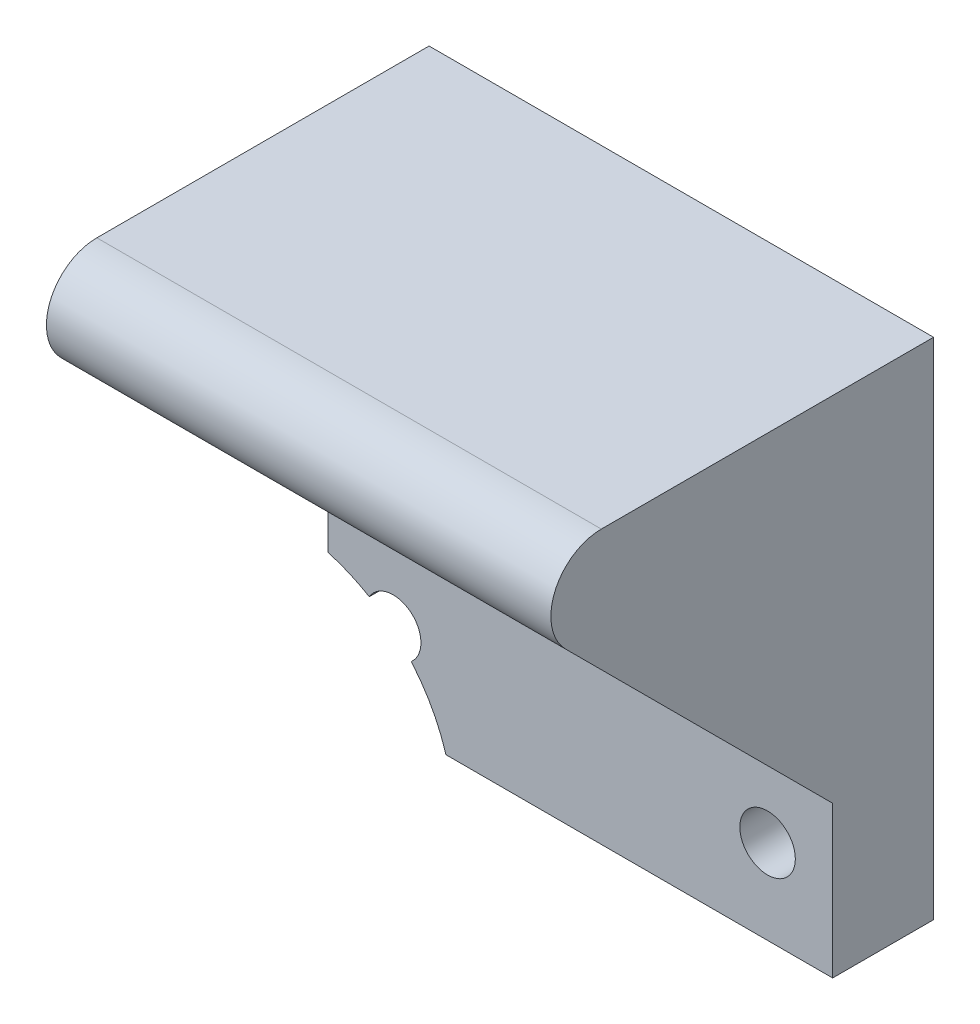
ISO-10303-21;
HEADER;
FILE_DESCRIPTION(('STEP AP214'),'2;1');
FILE_NAME('part.step','',(''),(''),'','','');
FILE_SCHEMA(('AUTOMOTIVE_DESIGN { 1 0 10303 214 1 1 1 1 }'));
ENDSEC;
DATA;
#1=APPLICATION_CONTEXT('core data for automotive mechanical design processes');
#2=APPLICATION_PROTOCOL_DEFINITION('international standard','automotive_design',2000,#1);
#3=PRODUCT_CONTEXT('',#1,'mechanical');
#4=PRODUCT('Part','Part','',(#3));
#5=PRODUCT_RELATED_PRODUCT_CATEGORY('part','',(#4));
#6=PRODUCT_DEFINITION_FORMATION('','',#4);
#7=PRODUCT_DEFINITION_CONTEXT('part definition',#1,'design');
#8=PRODUCT_DEFINITION('design','',#6,#7);
#9=PRODUCT_DEFINITION_SHAPE('','',#8);
#10=(LENGTH_UNIT() NAMED_UNIT(*) SI_UNIT(.MILLI.,.METRE.));
#11=(NAMED_UNIT(*) PLANE_ANGLE_UNIT() SI_UNIT($,.RADIAN.));
#12=(NAMED_UNIT(*) SI_UNIT($,.STERADIAN.) SOLID_ANGLE_UNIT());
#13=UNCERTAINTY_MEASURE_WITH_UNIT(LENGTH_MEASURE(1.E-05),#10,'distance_accuracy_value','');
#14=(GEOMETRIC_REPRESENTATION_CONTEXT(3) GLOBAL_UNCERTAINTY_ASSIGNED_CONTEXT((#13)) GLOBAL_UNIT_ASSIGNED_CONTEXT((#10,
#11,#12)) REPRESENTATION_CONTEXT('',''));
#15=CARTESIAN_POINT('',(0.,0.,0.));
#16=DIRECTION('',(0.,0.,1.));
#17=DIRECTION('',(1.,0.,0.));
#18=AXIS2_PLACEMENT_3D('',#15,#16,#17);
#19=CARTESIAN_POINT('',(-4.62664348486969,-4.84343020092796,0.));
#20=DIRECTION('',(0.,0.,1.));
#21=DIRECTION('',(1.,0.,0.));
#22=AXIS2_PLACEMENT_3D('',#19,#20,#21);
#23=CYLINDRICAL_SURFACE('',#22,17.);
#24=CARTESIAN_POINT('',(-4.62664348486969,-4.84343020092796,0.));
#25=DIRECTION('',(0.,0.,1.));
#26=DIRECTION('',(1.,0.,0.));
#27=AXIS2_PLACEMENT_3D('',#24,#25,#26);
#28=CIRCLE('',#27,17.);
#29=CARTESIAN_POINT('',(4.07197951204418,9.76252604840954,0.));
#30=VERTEX_POINT('',#29);
#31=CARTESIAN_POINT('',(0.,11.5148756424017,0.));
#32=VERTEX_POINT('',#31);
#33=EDGE_CURVE('E132',#30,#32,#28,.T.);
#34=ORIENTED_EDGE('',*,*,#33,.F.);
#35=DIRECTION('',(0.,0.,1.));
#36=VECTOR('',#35,1.);
#37=CARTESIAN_POINT('',(4.07197951204417,9.76252604840955,-5.));
#38=LINE('',#37,#36);
#39=CARTESIAN_POINT('',(4.07197951204417,9.76252604840955,10.));
#40=VERTEX_POINT('',#39);
#41=EDGE_CURVE('E116',#30,#40,#38,.T.);
#42=ORIENTED_EDGE('',*,*,#41,.T.);
#43=CARTESIAN_POINT('',(-4.62664348486969,-4.84343020092796,10.));
#44=DIRECTION('',(0.,0.,1.));
#45=DIRECTION('',(1.,0.,0.));
#46=AXIS2_PLACEMENT_3D('',#43,#44,#45);
#47=CIRCLE('',#46,17.);
#48=CARTESIAN_POINT('',(0.,11.5148756424017,10.));
#49=VERTEX_POINT('',#48);
#50=EDGE_CURVE('E130',#40,#49,#47,.T.);
#51=ORIENTED_EDGE('',*,*,#50,.T.);
#52=DIRECTION('',(0.,0.,1.));
#53=VECTOR('',#52,1.);
#54=CARTESIAN_POINT('',(0.,11.5148756424017,0.));
#55=LINE('',#54,#53);
#56=EDGE_CURVE('E180',#32,#49,#55,.T.);
#57=ORIENTED_EDGE('',*,*,#56,.F.);
#58=EDGE_LOOP('',(#34,#42,#51,#57));
#59=FACE_BOUND('',#58,.T.);
#60=ADVANCED_FACE('F43',(#59),#23,.F.);
#61=CARTESIAN_POINT('',(50.,0.,10.));
#62=DIRECTION('',(0.,1.,0.));
#63=DIRECTION('',(0.,0.,1.));
#64=AXIS2_PLACEMENT_3D('',#61,#62,#63);
#65=PLANE('',#64);
#66=DIRECTION('',(-1.,0.,0.));
#67=VECTOR('',#66,1.);
#68=CARTESIAN_POINT('',(50.,0.,10.));
#69=LINE('',#68,#67);
#70=CARTESIAN_POINT('',(50.,0.,10.));
#71=VERTEX_POINT('',#70);
#72=CARTESIAN_POINT('',(11.6687909643476,0.,10.));
#73=VERTEX_POINT('',#72);
#74=EDGE_CURVE('E163',#71,#73,#69,.T.);
#75=ORIENTED_EDGE('',*,*,#74,.T.);
#76=DIRECTION('',(0.,0.,1.));
#77=VECTOR('',#76,1.);
#78=CARTESIAN_POINT('',(11.6687909643476,0.,0.));
#79=LINE('',#78,#77);
#80=CARTESIAN_POINT('',(11.6687909643476,0.,0.));
#81=VERTEX_POINT('',#80);
#82=EDGE_CURVE('E148',#73,#81,#79,.F.);
#83=ORIENTED_EDGE('',*,*,#82,.T.);
#84=DIRECTION('',(-1.,0.,0.));
#85=VECTOR('',#84,1.);
#86=CARTESIAN_POINT('',(50.,0.,0.));
#87=LINE('',#86,#85);
#88=CARTESIAN_POINT('',(50.,0.,0.));
#89=VERTEX_POINT('',#88);
#90=EDGE_CURVE('E177',#89,#81,#87,.T.);
#91=ORIENTED_EDGE('',*,*,#90,.F.);
#92=DIRECTION('',(0.,0.,-1.));
#93=VECTOR('',#92,1.);
#94=CARTESIAN_POINT('',(50.,0.,10.));
#95=LINE('',#94,#93);
#96=EDGE_CURVE('E152',#71,#89,#95,.T.);
#97=ORIENTED_EDGE('',*,*,#96,.F.);
#98=EDGE_LOOP('',(#75,#83,#91,#97));
#99=FACE_BOUND('',#98,.T.);
#100=ADVANCED_FACE('F209',(#99),#65,.F.);
#101=CARTESIAN_POINT('',(50.,0.,0.));
#102=DIRECTION('',(0.,0.,1.));
#103=DIRECTION('',(1.,0.,0.));
#104=AXIS2_PLACEMENT_3D('',#101,#102,#103);
#105=PLANE('',#104);
#106=CARTESIAN_POINT('',(43.5502138741288,8.36656836033639,0.));
#107=DIRECTION('',(0.,0.,1.));
#108=DIRECTION('',(1.,0.,0.));
#109=AXIS2_PLACEMENT_3D('',#106,#107,#108);
#110=CIRCLE('',#109,2.75);
#111=CARTESIAN_POINT('',(46.3002138741288,8.36656836033639,0.));
#112=VERTEX_POINT('',#111);
#113=EDGE_CURVE('E141',#112,#112,#110,.T.);
#114=ORIENTED_EDGE('',*,*,#113,.T.);
#115=EDGE_LOOP('',(#114));
#116=FACE_BOUND('',#115,.T.);
#117=CARTESIAN_POINT('',(8.23058028566451,6.27825118789137,0.));
#118=VERTEX_POINT('',#117);
#119=EDGE_CURVE('E147',#81,#118,#28,.T.);
#120=ORIENTED_EDGE('',*,*,#119,.T.);
#121=CARTESIAN_POINT('',(6.44132586348994,8.36656836033639,0.));
#122=DIRECTION('',(0.,0.,1.));
#123=DIRECTION('',(1.,0.,0.));
#124=AXIS2_PLACEMENT_3D('',#121,#122,#123);
#125=CIRCLE('',#124,2.75);
#126=EDGE_CURVE('E124',#118,#30,#125,.T.);
#127=ORIENTED_EDGE('',*,*,#126,.T.);
#128=ORIENTED_EDGE('',*,*,#33,.T.);
#129=DIRECTION('',(0.,1.,0.));
#130=VECTOR('',#129,1.);
#131=CARTESIAN_POINT('',(0.,0.,0.));
#132=LINE('',#131,#130);
#133=CARTESIAN_POINT('',(0.,50.,0.));
#134=VERTEX_POINT('',#133);
#135=EDGE_CURVE('E151',#32,#134,#132,.T.);
#136=ORIENTED_EDGE('',*,*,#135,.T.);
#137=DIRECTION('',(-1.,0.,0.));
#138=VECTOR('',#137,1.);
#139=CARTESIAN_POINT('',(50.,50.,0.));
#140=LINE('',#139,#138);
#141=CARTESIAN_POINT('',(50.,50.,0.));
#142=VERTEX_POINT('',#141);
#143=EDGE_CURVE('E174',#142,#134,#140,.T.);
#144=ORIENTED_EDGE('',*,*,#143,.F.);
#145=DIRECTION('',(0.,1.,0.));
#146=VECTOR('',#145,1.);
#147=CARTESIAN_POINT('',(50.,0.,0.));
#148=LINE('',#147,#146);
#149=EDGE_CURVE('E155',#89,#142,#148,.T.);
#150=ORIENTED_EDGE('',*,*,#149,.F.);
#151=ORIENTED_EDGE('',*,*,#90,.T.);
#152=EDGE_LOOP('',(#120,#127,#128,#136,#144,#150,#151));
#153=FACE_BOUND('',#152,.T.);
#154=ADVANCED_FACE('F197',(#116,#153),#105,.F.);
#155=CARTESIAN_POINT('',(50.,50.,0.));
#156=DIRECTION('',(0.,-1.,0.));
#157=DIRECTION('',(0.,0.,-1.));
#158=AXIS2_PLACEMENT_3D('',#155,#156,#157);
#159=PLANE('',#158);
#160=DIRECTION('',(0.,0.,1.));
#161=VECTOR('',#160,1.);
#162=CARTESIAN_POINT('',(0.,50.,0.));
#163=LINE('',#162,#161);
#164=CARTESIAN_POINT('',(0.,50.,32.9289321881348));
#165=VERTEX_POINT('',#164);
#166=EDGE_CURVE('E165',#134,#165,#163,.T.);
#167=ORIENTED_EDGE('',*,*,#166,.T.);
#168=DIRECTION('',(-1.,0.,0.));
#169=VECTOR('',#168,1.);
#170=CARTESIAN_POINT('',(50.,50.,32.9289321881348));
#171=LINE('',#170,#169);
#172=CARTESIAN_POINT('',(50.,50.,32.9289321881348));
#173=VERTEX_POINT('',#172);
#174=EDGE_CURVE('E51',#165,#173,#171,.F.);
#175=ORIENTED_EDGE('',*,*,#174,.T.);
#176=DIRECTION('',(0.,0.,1.));
#177=VECTOR('',#176,1.);
#178=CARTESIAN_POINT('',(50.,50.,0.));
#179=LINE('',#178,#177);
#180=EDGE_CURVE('E157',#142,#173,#179,.T.);
#181=ORIENTED_EDGE('',*,*,#180,.F.);
#182=ORIENTED_EDGE('',*,*,#143,.T.);
#183=EDGE_LOOP('',(#167,#175,#181,#182));
#184=FACE_BOUND('',#183,.T.);
#185=ADVANCED_FACE('F198',(#184),#159,.F.);
#186=CARTESIAN_POINT('',(50.,50.,45.0000000000004));
#187=DIRECTION('',(0.,0.707106781186551,-0.707106781186544));
#188=DIRECTION('',(0.,0.707106781186544,0.707106781186551));
#189=AXIS2_PLACEMENT_3D('',#186,#187,#188);
#190=PLANE('',#189);
#191=DIRECTION('',(0.,-0.707106781186544,-0.707106781186551));
#192=VECTOR('',#191,1.);
#193=CARTESIAN_POINT('',(50.,50.,45.0000000000004));
#194=LINE('',#193,#192);
#195=CARTESIAN_POINT('',(50.,41.4644660940672,36.4644660940675));
#196=VERTEX_POINT('',#195);
#197=CARTESIAN_POINT('',(50.,15.,10.));
#198=VERTEX_POINT('',#197);
#199=EDGE_CURVE('E159',#196,#198,#194,.T.);
#200=ORIENTED_EDGE('',*,*,#199,.F.);
#201=DIRECTION('',(-1.,0.,0.));
#202=VECTOR('',#201,1.);
#203=CARTESIAN_POINT('',(50.,41.4644660940672,36.4644660940675));
#204=LINE('',#203,#202);
#205=CARTESIAN_POINT('',(0.,41.4644660940672,36.4644660940675));
#206=VERTEX_POINT('',#205);
#207=EDGE_CURVE('E133',#196,#206,#204,.T.);
#208=ORIENTED_EDGE('',*,*,#207,.T.);
#209=DIRECTION('',(0.,-0.707106781186544,-0.707106781186551));
#210=VECTOR('',#209,1.);
#211=CARTESIAN_POINT('',(0.,50.,45.0000000000004));
#212=LINE('',#211,#210);
#213=CARTESIAN_POINT('',(0.,15.,10.));
#214=VERTEX_POINT('',#213);
#215=EDGE_CURVE('E167',#206,#214,#212,.T.);
#216=ORIENTED_EDGE('',*,*,#215,.T.);
#217=DIRECTION('',(-1.,0.,0.));
#218=VECTOR('',#217,1.);
#219=CARTESIAN_POINT('',(50.,15.,10.));
#220=LINE('',#219,#218);
#221=EDGE_CURVE('E172',#198,#214,#220,.T.);
#222=ORIENTED_EDGE('',*,*,#221,.F.);
#223=EDGE_LOOP('',(#200,#208,#216,#222));
#224=FACE_BOUND('',#223,.T.);
#225=ADVANCED_FACE('F188',(#224),#190,.F.);
#226=CARTESIAN_POINT('',(50.,15.,10.));
#227=DIRECTION('',(0.,0.,-1.));
#228=DIRECTION('',(0.,1.,0.));
#229=AXIS2_PLACEMENT_3D('',#226,#227,#228);
#230=PLANE('',#229);
#231=CARTESIAN_POINT('',(43.5502138741288,8.36656836033639,10.));
#232=DIRECTION('',(0.,0.,1.));
#233=DIRECTION('',(1.,0.,0.));
#234=AXIS2_PLACEMENT_3D('',#231,#232,#233);
#235=CIRCLE('',#234,2.75);
#236=CARTESIAN_POINT('',(46.3002138741288,8.36656836033639,10.));
#237=VERTEX_POINT('',#236);
#238=EDGE_CURVE('E125',#237,#237,#235,.T.);
#239=ORIENTED_EDGE('',*,*,#238,.F.);
#240=EDGE_LOOP('',(#239));
#241=FACE_BOUND('',#240,.T.);
#242=ORIENTED_EDGE('',*,*,#50,.F.);
#243=CARTESIAN_POINT('',(6.44132586348994,8.36656836033639,10.));
#244=DIRECTION('',(0.,0.,1.));
#245=DIRECTION('',(1.,0.,0.));
#246=AXIS2_PLACEMENT_3D('',#243,#244,#245);
#247=CIRCLE('',#246,2.75);
#248=CARTESIAN_POINT('',(8.23058028566451,6.27825118789137,10.));
#249=VERTEX_POINT('',#248);
#250=EDGE_CURVE('E113',#249,#40,#247,.T.);
#251=ORIENTED_EDGE('',*,*,#250,.F.);
#252=EDGE_CURVE('E140',#73,#249,#47,.T.);
#253=ORIENTED_EDGE('',*,*,#252,.F.);
#254=ORIENTED_EDGE('',*,*,#74,.F.);
#255=DIRECTION('',(0.,-1.,0.));
#256=VECTOR('',#255,1.);
#257=CARTESIAN_POINT('',(50.,15.,10.));
#258=LINE('',#257,#256);
#259=EDGE_CURVE('E161',#198,#71,#258,.T.);
#260=ORIENTED_EDGE('',*,*,#259,.F.);
#261=ORIENTED_EDGE('',*,*,#221,.T.);
#262=DIRECTION('',(0.,-1.,0.));
#263=VECTOR('',#262,1.);
#264=CARTESIAN_POINT('',(0.,15.,10.));
#265=LINE('',#264,#263);
#266=EDGE_CURVE('E139',#214,#49,#265,.T.);
#267=ORIENTED_EDGE('',*,*,#266,.T.);
#268=EDGE_LOOP('',(#242,#251,#253,#254,#260,#261,#267));
#269=FACE_BOUND('',#268,.T.);
#270=ADVANCED_FACE('F136',(#241,#269),#230,.F.);
#271=CARTESIAN_POINT('',(50.,0.,0.));
#272=DIRECTION('',(1.,0.,0.));
#273=DIRECTION('',(0.,0.,-1.));
#274=AXIS2_PLACEMENT_3D('',#271,#272,#273);
#275=PLANE('',#274);
#276=ORIENTED_EDGE('',*,*,#180,.T.);
#277=CARTESIAN_POINT('',(50.,45.,32.9289321881348));
#278=DIRECTION('',(1.,0.,0.));
#279=DIRECTION('',(0.,0.,-1.));
#280=AXIS2_PLACEMENT_3D('',#277,#278,#279);
#281=CIRCLE('',#280,5.);
#282=EDGE_CURVE('E11',#173,#196,#281,.T.);
#283=ORIENTED_EDGE('',*,*,#282,.T.);
#284=ORIENTED_EDGE('',*,*,#199,.T.);
#285=ORIENTED_EDGE('',*,*,#259,.T.);
#286=ORIENTED_EDGE('',*,*,#96,.T.);
#287=ORIENTED_EDGE('',*,*,#149,.T.);
#288=EDGE_LOOP('',(#276,#283,#284,#285,#286,#287));
#289=FACE_BOUND('',#288,.T.);
#290=ADVANCED_FACE('F200',(#289),#275,.T.);
#291=CARTESIAN_POINT('',(0.,0.,0.));
#292=DIRECTION('',(1.,0.,0.));
#293=DIRECTION('',(0.,0.,-1.));
#294=AXIS2_PLACEMENT_3D('',#291,#292,#293);
#295=PLANE('',#294);
#296=ORIENTED_EDGE('',*,*,#215,.F.);
#297=CARTESIAN_POINT('',(0.,45.,32.9289321881348));
#298=DIRECTION('',(1.,0.,0.));
#299=DIRECTION('',(0.,0.,-1.));
#300=AXIS2_PLACEMENT_3D('',#297,#298,#299);
#301=CIRCLE('',#300,5.);
#302=EDGE_CURVE('E65',#206,#165,#301,.F.);
#303=ORIENTED_EDGE('',*,*,#302,.T.);
#304=ORIENTED_EDGE('',*,*,#166,.F.);
#305=ORIENTED_EDGE('',*,*,#135,.F.);
#306=ORIENTED_EDGE('',*,*,#56,.T.);
#307=ORIENTED_EDGE('',*,*,#266,.F.);
#308=EDGE_LOOP('',(#296,#303,#304,#305,#306,#307));
#309=FACE_BOUND('',#308,.T.);
#310=ADVANCED_FACE('F192',(#309),#295,.F.);
#311=ORIENTED_EDGE('',*,*,#252,.T.);
#312=DIRECTION('',(0.,0.,1.));
#313=VECTOR('',#312,1.);
#314=CARTESIAN_POINT('',(8.23058028566451,6.27825118789137,-5.));
#315=LINE('',#314,#313);
#316=EDGE_CURVE('E119',#249,#118,#315,.F.);
#317=ORIENTED_EDGE('',*,*,#316,.T.);
#318=ORIENTED_EDGE('',*,*,#119,.F.);
#319=ORIENTED_EDGE('',*,*,#82,.F.);
#320=EDGE_LOOP('',(#311,#317,#318,#319));
#321=FACE_BOUND('',#320,.T.);
#322=ADVANCED_FACE('F211',(#321),#23,.F.);
#323=CARTESIAN_POINT('',(6.44132586348994,8.36656836033639,-20.));
#324=DIRECTION('',(0.,0.,1.));
#325=DIRECTION('',(1.,0.,0.));
#326=AXIS2_PLACEMENT_3D('',#323,#324,#325);
#327=CYLINDRICAL_SURFACE('',#326,2.75);
#328=ORIENTED_EDGE('',*,*,#126,.F.);
#329=ORIENTED_EDGE('',*,*,#316,.F.);
#330=ORIENTED_EDGE('',*,*,#250,.T.);
#331=ORIENTED_EDGE('',*,*,#41,.F.);
#332=EDGE_LOOP('',(#328,#329,#330,#331));
#333=FACE_BOUND('',#332,.T.);
#334=ADVANCED_FACE('F115',(#333),#327,.F.);
#335=CARTESIAN_POINT('',(43.5502138741288,8.36656836033639,-20.));
#336=DIRECTION('',(0.,0.,1.));
#337=DIRECTION('',(1.,0.,0.));
#338=AXIS2_PLACEMENT_3D('',#335,#336,#337);
#339=CYLINDRICAL_SURFACE('',#338,2.75);
#340=ORIENTED_EDGE('',*,*,#238,.T.);
#341=EDGE_LOOP('',(#340));
#342=FACE_BOUND('',#341,.T.);
#343=ORIENTED_EDGE('',*,*,#113,.F.);
#344=EDGE_LOOP('',(#343));
#345=FACE_BOUND('',#344,.T.);
#346=ADVANCED_FACE('F202',(#342,#345),#339,.F.);
#347=CARTESIAN_POINT('',(50.,45.,32.9289321881348));
#348=DIRECTION('',(-1.,0.,0.));
#349=DIRECTION('',(0.,0.,1.));
#350=AXIS2_PLACEMENT_3D('',#347,#348,#349);
#351=CYLINDRICAL_SURFACE('',#350,5.);
#352=ORIENTED_EDGE('',*,*,#282,.F.);
#353=ORIENTED_EDGE('',*,*,#174,.F.);
#354=ORIENTED_EDGE('',*,*,#302,.F.);
#355=ORIENTED_EDGE('',*,*,#207,.F.);
#356=EDGE_LOOP('',(#352,#353,#354,#355));
#357=FACE_BOUND('',#356,.T.);
#358=ADVANCED_FACE('F45',(#357),#351,.T.);
#359=CLOSED_SHELL('',(#60,#100,#154,#185,#225,#270,#290,#310,#322,#334,#346,#358));
#360=MANIFOLD_SOLID_BREP('B2',#359);
#361=ADVANCED_BREP_SHAPE_REPRESENTATION('',(#18,#360),#14);
#362=SHAPE_DEFINITION_REPRESENTATION(#9,#361);
ENDSEC;
END-ISO-10303-21;
